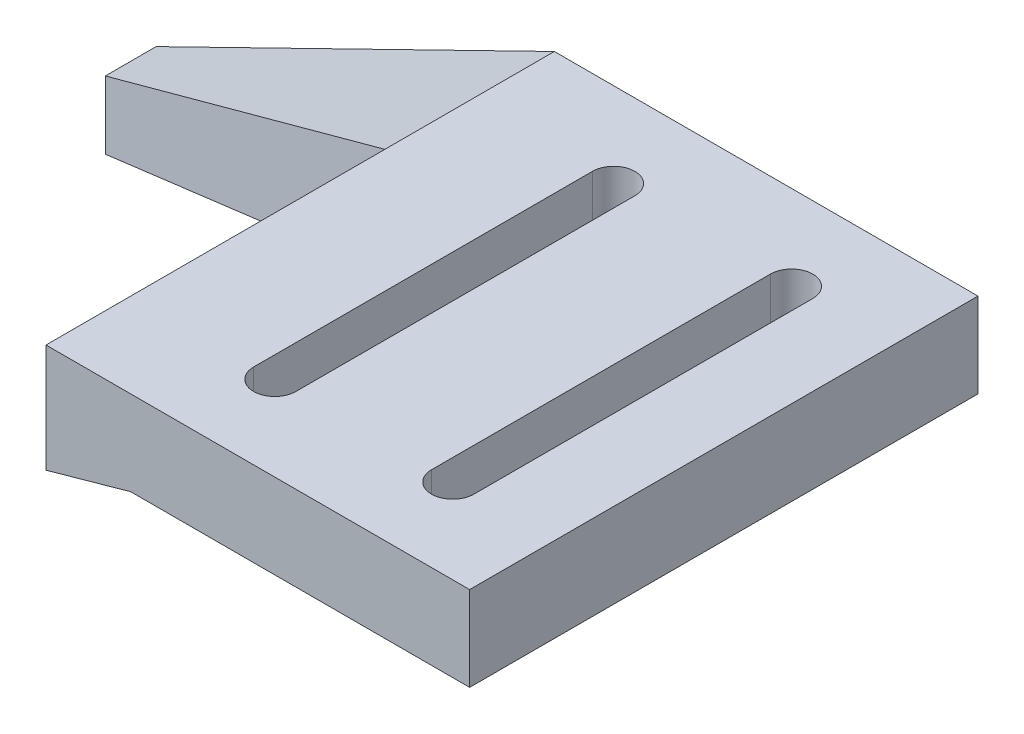
ISO-10303-21;
HEADER;
FILE_DESCRIPTION(('STEP AP214'),'2;1');
FILE_NAME('part.step','',(''),(''),'','','');
FILE_SCHEMA(('AUTOMOTIVE_DESIGN { 1 0 10303 214 1 1 1 1 }'));
ENDSEC;
DATA;
#1=APPLICATION_CONTEXT('core data for automotive mechanical design processes');
#2=APPLICATION_PROTOCOL_DEFINITION('international standard','automotive_design',2000,#1);
#3=PRODUCT_CONTEXT('',#1,'mechanical');
#4=PRODUCT('Part','Part','',(#3));
#5=PRODUCT_RELATED_PRODUCT_CATEGORY('part','',(#4));
#6=PRODUCT_DEFINITION_FORMATION('','',#4);
#7=PRODUCT_DEFINITION_CONTEXT('part definition',#1,'design');
#8=PRODUCT_DEFINITION('design','',#6,#7);
#9=PRODUCT_DEFINITION_SHAPE('','',#8);
#10=(LENGTH_UNIT() NAMED_UNIT(*) SI_UNIT(.MILLI.,.METRE.));
#11=(NAMED_UNIT(*) PLANE_ANGLE_UNIT() SI_UNIT($,.RADIAN.));
#12=(NAMED_UNIT(*) SI_UNIT($,.STERADIAN.) SOLID_ANGLE_UNIT());
#13=UNCERTAINTY_MEASURE_WITH_UNIT(LENGTH_MEASURE(1.E-05),#10,'distance_accuracy_value','');
#14=(GEOMETRIC_REPRESENTATION_CONTEXT(3) GLOBAL_UNCERTAINTY_ASSIGNED_CONTEXT((#13)) GLOBAL_UNIT_ASSIGNED_CONTEXT((#10,
#11,#12)) REPRESENTATION_CONTEXT('',''));
#15=CARTESIAN_POINT('',(0.,0.,0.));
#16=DIRECTION('',(0.,0.,1.));
#17=DIRECTION('',(1.,0.,0.));
#18=AXIS2_PLACEMENT_3D('',#15,#16,#17);
#19=CARTESIAN_POINT('',(0.44139465875371,-1.57640949554897,5.));
#20=DIRECTION('',(-0.269629925519971,0.962964019714182,0.));
#21=DIRECTION('',(-0.962964019714182,-0.269629925519971,0.));
#22=AXIS2_PLACEMENT_3D('',#19,#20,#21);
#23=PLANE('',#22);
#24=DIRECTION('',(0.,0.,-1.));
#25=VECTOR('',#24,1.);
#26=CARTESIAN_POINT('',(-22.5,-8.,5.));
#27=LINE('',#26,#25);
#28=CARTESIAN_POINT('',(-22.5,-8.,1.5));
#29=VERTEX_POINT('',#28);
#30=CARTESIAN_POINT('',(-22.5,-8.,-1.5));
#31=VERTEX_POINT('',#30);
#32=EDGE_CURVE('E306',#29,#31,#27,.T.);
#33=ORIENTED_EDGE('',*,*,#32,.T.);
#34=DIRECTION('',(0.9495751305048,0.265881036541344,-0.16617564783834));
#35=VECTOR('',#34,1.);
#36=CARTESIAN_POINT('',(-1.2177926557111,-2.04098194359911,-5.22438628525056));
#37=LINE('',#36,#35);
#38=CARTESIAN_POINT('',(-2.49999999999999,-2.4,-5.));
#39=VERTEX_POINT('',#38);
#40=EDGE_CURVE('E279',#31,#39,#37,.T.);
#41=ORIENTED_EDGE('',*,*,#40,.T.);
#42=DIRECTION('',(0.962964019714182,0.269629925519971,0.));
#43=VECTOR('',#42,1.);
#44=CARTESIAN_POINT('',(0.44139465875371,-1.57640949554897,-5.));
#45=LINE('',#44,#43);
#46=CARTESIAN_POINT('',(2.50000000000001,-1.,-5.));
#47=VERTEX_POINT('',#46);
#48=EDGE_CURVE('E291',#39,#47,#45,.T.);
#49=ORIENTED_EDGE('',*,*,#48,.T.);
#50=DIRECTION('',(0.,0.,-1.));
#51=VECTOR('',#50,1.);
#52=CARTESIAN_POINT('',(2.50000000000001,-1.,5.));
#53=LINE('',#52,#51);
#54=CARTESIAN_POINT('',(2.50000000000001,-1.,25.));
#55=VERTEX_POINT('',#54);
#56=EDGE_CURVE('E324',#55,#47,#53,.T.);
#57=ORIENTED_EDGE('',*,*,#56,.F.);
#58=DIRECTION('',(0.962964019714182,0.269629925519971,0.));
#59=VECTOR('',#58,1.);
#60=CARTESIAN_POINT('',(-2.49999999999998,-2.4,25.));
#61=LINE('',#60,#59);
#62=CARTESIAN_POINT('',(-2.49999999999998,-2.4,25.));
#63=VERTEX_POINT('',#62);
#64=EDGE_CURVE('E248',#63,#55,#61,.T.);
#65=ORIENTED_EDGE('',*,*,#64,.F.);
#66=DIRECTION('',(0.,0.,-1.));
#67=VECTOR('',#66,1.);
#68=CARTESIAN_POINT('',(-2.49999999999998,-2.4,25.));
#69=LINE('',#68,#67);
#70=CARTESIAN_POINT('',(-2.49999999999998,-2.4,5.));
#71=VERTEX_POINT('',#70);
#72=EDGE_CURVE('E260',#63,#71,#69,.T.);
#73=ORIENTED_EDGE('',*,*,#72,.T.);
#74=DIRECTION('',(-0.9495751305048,-0.265881036541344,-0.16617564783834));
#75=VECTOR('',#74,1.);
#76=CARTESIAN_POINT('',(0.360169969117019,-1.59915240864724,5.50052974459547));
#77=LINE('',#76,#75);
#78=EDGE_CURVE('E287',#71,#29,#77,.T.);
#79=ORIENTED_EDGE('',*,*,#78,.T.);
#80=EDGE_LOOP('',(#33,#41,#49,#57,#65,#73,#79));
#81=FACE_BOUND('',#80,.T.);
#82=ADVANCED_FACE('F41',(#81),#23,.F.);
#83=CARTESIAN_POINT('',(0.,-1.,5.));
#84=DIRECTION('',(0.,-1.,0.));
#85=DIRECTION('',(1.,0.,0.));
#86=AXIS2_PLACEMENT_3D('',#83,#84,#85);
#87=PLANE('',#86);
#88=CARTESIAN_POINT('',(6.,-1.,0.));
#89=DIRECTION('',(0.,-1.,0.));
#90=DIRECTION('',(1.,0.,0.));
#91=AXIS2_PLACEMENT_3D('',#88,#89,#90);
#92=CIRCLE('',#91,1.25);
#93=CARTESIAN_POINT('',(4.75,-1.,0.));
#94=VERTEX_POINT('',#93);
#95=CARTESIAN_POINT('',(7.25,-1.,0.));
#96=VERTEX_POINT('',#95);
#97=EDGE_CURVE('E238',#94,#96,#92,.T.);
#98=ORIENTED_EDGE('',*,*,#97,.F.);
#99=DIRECTION('',(0.,0.,-1.));
#100=VECTOR('',#99,1.);
#101=CARTESIAN_POINT('',(4.75,-1.,5.));
#102=LINE('',#101,#100);
#103=CARTESIAN_POINT('',(4.75,-1.,20.));
#104=VERTEX_POINT('',#103);
#105=EDGE_CURVE('E230',#104,#94,#102,.T.);
#106=ORIENTED_EDGE('',*,*,#105,.F.);
#107=CARTESIAN_POINT('',(6.,-1.,20.));
#108=DIRECTION('',(0.,-1.,0.));
#109=DIRECTION('',(1.,0.,0.));
#110=AXIS2_PLACEMENT_3D('',#107,#108,#109);
#111=CIRCLE('',#110,1.25);
#112=CARTESIAN_POINT('',(7.25,-1.,20.));
#113=VERTEX_POINT('',#112);
#114=EDGE_CURVE('E159',#113,#104,#111,.T.);
#115=ORIENTED_EDGE('',*,*,#114,.F.);
#116=DIRECTION('',(0.,0.,1.));
#117=VECTOR('',#116,1.);
#118=CARTESIAN_POINT('',(7.25,-1.,5.));
#119=LINE('',#118,#117);
#120=EDGE_CURVE('E235',#96,#113,#119,.T.);
#121=ORIENTED_EDGE('',*,*,#120,.F.);
#122=EDGE_LOOP('',(#98,#106,#115,#121));
#123=FACE_BOUND('',#122,.T.);
#124=CARTESIAN_POINT('',(16.5,-0.999999999999997,0.));
#125=DIRECTION('',(0.,-1.,0.));
#126=DIRECTION('',(1.,0.,0.));
#127=AXIS2_PLACEMENT_3D('',#124,#125,#126);
#128=CIRCLE('',#127,1.25);
#129=CARTESIAN_POINT('',(15.25,-1.,0.));
#130=VERTEX_POINT('',#129);
#131=CARTESIAN_POINT('',(17.75,-0.999999999999997,0.));
#132=VERTEX_POINT('',#131);
#133=EDGE_CURVE('E227',#130,#132,#128,.T.);
#134=ORIENTED_EDGE('',*,*,#133,.F.);
#135=DIRECTION('',(0.,0.,-1.));
#136=VECTOR('',#135,1.);
#137=CARTESIAN_POINT('',(15.25,-0.999999999999999,5.));
#138=LINE('',#137,#136);
#139=CARTESIAN_POINT('',(15.25,-0.999999999999999,20.));
#140=VERTEX_POINT('',#139);
#141=EDGE_CURVE('E188',#140,#130,#138,.T.);
#142=ORIENTED_EDGE('',*,*,#141,.F.);
#143=CARTESIAN_POINT('',(16.5,-0.999999999999997,20.));
#144=DIRECTION('',(0.,-1.,0.));
#145=DIRECTION('',(1.,0.,0.));
#146=AXIS2_PLACEMENT_3D('',#143,#144,#145);
#147=CIRCLE('',#146,1.25);
#148=CARTESIAN_POINT('',(17.75,-0.999999999999997,20.));
#149=VERTEX_POINT('',#148);
#150=EDGE_CURVE('E221',#149,#140,#147,.T.);
#151=ORIENTED_EDGE('',*,*,#150,.F.);
#152=DIRECTION('',(0.,0.,1.));
#153=VECTOR('',#152,1.);
#154=CARTESIAN_POINT('',(17.75,-0.999999999999999,5.));
#155=LINE('',#154,#153);
#156=EDGE_CURVE('E224',#132,#149,#155,.T.);
#157=ORIENTED_EDGE('',*,*,#156,.F.);
#158=EDGE_LOOP('',(#134,#142,#151,#157));
#159=FACE_BOUND('',#158,.T.);
#160=DIRECTION('',(-1.,0.,0.));
#161=VECTOR('',#160,1.);
#162=CARTESIAN_POINT('',(0.,-1.,-5.));
#163=LINE('',#162,#161);
#164=CARTESIAN_POINT('',(22.5,-0.999999999999998,-5.));
#165=VERTEX_POINT('',#164);
#166=EDGE_CURVE('E294',#165,#47,#163,.T.);
#167=ORIENTED_EDGE('',*,*,#166,.F.);
#168=DIRECTION('',(0.,0.,-1.));
#169=VECTOR('',#168,1.);
#170=CARTESIAN_POINT('',(22.5,-0.999999999999998,5.));
#171=LINE('',#170,#169);
#172=CARTESIAN_POINT('',(22.5,-0.999999999999998,25.));
#173=VERTEX_POINT('',#172);
#174=EDGE_CURVE('E321',#173,#165,#171,.T.);
#175=ORIENTED_EDGE('',*,*,#174,.F.);
#176=DIRECTION('',(1.,0.,0.));
#177=VECTOR('',#176,1.);
#178=CARTESIAN_POINT('',(2.50000000000001,-1.,25.));
#179=LINE('',#178,#177);
#180=EDGE_CURVE('E252',#55,#173,#179,.T.);
#181=ORIENTED_EDGE('',*,*,#180,.F.);
#182=ORIENTED_EDGE('',*,*,#56,.T.);
#183=EDGE_LOOP('',(#167,#175,#181,#182));
#184=FACE_BOUND('',#183,.T.);
#185=ADVANCED_FACE('F355',(#123,#159,#184),#87,.T.);
#186=CARTESIAN_POINT('',(22.5,0.,5.));
#187=DIRECTION('',(1.,0.,0.));
#188=DIRECTION('',(0.,1.,0.));
#189=AXIS2_PLACEMENT_3D('',#186,#187,#188);
#190=PLANE('',#189);
#191=DIRECTION('',(0.,-1.,0.));
#192=VECTOR('',#191,1.);
#193=CARTESIAN_POINT('',(22.5,0.,-5.));
#194=LINE('',#193,#192);
#195=CARTESIAN_POINT('',(22.5,4.,-5.));
#196=VERTEX_POINT('',#195);
#197=EDGE_CURVE('E298',#196,#165,#194,.T.);
#198=ORIENTED_EDGE('',*,*,#197,.F.);
#199=DIRECTION('',(0.,0.,-1.));
#200=VECTOR('',#199,1.);
#201=CARTESIAN_POINT('',(22.5,4.,5.));
#202=LINE('',#201,#200);
#203=CARTESIAN_POINT('',(22.5,4.,25.));
#204=VERTEX_POINT('',#203);
#205=EDGE_CURVE('E318',#204,#196,#202,.T.);
#206=ORIENTED_EDGE('',*,*,#205,.F.);
#207=DIRECTION('',(0.,1.,0.));
#208=VECTOR('',#207,1.);
#209=CARTESIAN_POINT('',(22.5,-0.999999999999998,25.));
#210=LINE('',#209,#208);
#211=EDGE_CURVE('E256',#173,#204,#210,.T.);
#212=ORIENTED_EDGE('',*,*,#211,.F.);
#213=ORIENTED_EDGE('',*,*,#174,.T.);
#214=EDGE_LOOP('',(#198,#206,#212,#213));
#215=FACE_BOUND('',#214,.T.);
#216=ADVANCED_FACE('F352',(#215),#190,.T.);
#217=CARTESIAN_POINT('',(0.,4.,5.));
#218=DIRECTION('',(0.,-1.,0.));
#219=DIRECTION('',(1.,0.,0.));
#220=AXIS2_PLACEMENT_3D('',#217,#218,#219);
#221=PLANE('',#220);
#222=DIRECTION('',(0.,0.,1.));
#223=VECTOR('',#222,1.);
#224=CARTESIAN_POINT('',(4.75,4.,0.));
#225=LINE('',#224,#223);
#226=CARTESIAN_POINT('',(4.75,4.,0.));
#227=VERTEX_POINT('',#226);
#228=CARTESIAN_POINT('',(4.75,4.,20.));
#229=VERTEX_POINT('',#228);
#230=EDGE_CURVE('E167',#227,#229,#225,.T.);
#231=ORIENTED_EDGE('',*,*,#230,.F.);
#232=CARTESIAN_POINT('',(6.,4.,0.));
#233=DIRECTION('',(0.,1.,0.));
#234=DIRECTION('',(-1.,0.,0.));
#235=AXIS2_PLACEMENT_3D('',#232,#233,#234);
#236=CIRCLE('',#235,1.25);
#237=CARTESIAN_POINT('',(7.25,4.,0.));
#238=VERTEX_POINT('',#237);
#239=EDGE_CURVE('E173',#238,#227,#236,.T.);
#240=ORIENTED_EDGE('',*,*,#239,.F.);
#241=DIRECTION('',(0.,0.,-1.));
#242=VECTOR('',#241,1.);
#243=CARTESIAN_POINT('',(7.25,4.,0.));
#244=LINE('',#243,#242);
#245=CARTESIAN_POINT('',(7.25,4.,20.));
#246=VERTEX_POINT('',#245);
#247=EDGE_CURVE('E178',#246,#238,#244,.T.);
#248=ORIENTED_EDGE('',*,*,#247,.F.);
#249=CARTESIAN_POINT('',(6.,4.,20.));
#250=DIRECTION('',(0.,1.,0.));
#251=DIRECTION('',(-1.,0.,0.));
#252=AXIS2_PLACEMENT_3D('',#249,#250,#251);
#253=CIRCLE('',#252,1.25);
#254=EDGE_CURVE('E156',#229,#246,#253,.T.);
#255=ORIENTED_EDGE('',*,*,#254,.F.);
#256=EDGE_LOOP('',(#231,#240,#248,#255));
#257=FACE_BOUND('',#256,.T.);
#258=DIRECTION('',(0.,0.,1.));
#259=VECTOR('',#258,1.);
#260=CARTESIAN_POINT('',(15.25,4.,0.));
#261=LINE('',#260,#259);
#262=CARTESIAN_POINT('',(15.25,4.,0.));
#263=VERTEX_POINT('',#262);
#264=CARTESIAN_POINT('',(15.25,4.,20.));
#265=VERTEX_POINT('',#264);
#266=EDGE_CURVE('E196',#263,#265,#261,.T.);
#267=ORIENTED_EDGE('',*,*,#266,.F.);
#268=CARTESIAN_POINT('',(16.5,4.,0.));
#269=DIRECTION('',(0.,1.,0.));
#270=DIRECTION('',(1.,0.,0.));
#271=AXIS2_PLACEMENT_3D('',#268,#269,#270);
#272=CIRCLE('',#271,1.25);
#273=CARTESIAN_POINT('',(17.75,4.,0.));
#274=VERTEX_POINT('',#273);
#275=EDGE_CURVE('E193',#274,#263,#272,.T.);
#276=ORIENTED_EDGE('',*,*,#275,.F.);
#277=DIRECTION('',(0.,0.,-1.));
#278=VECTOR('',#277,1.);
#279=CARTESIAN_POINT('',(17.75,4.,0.));
#280=LINE('',#279,#278);
#281=CARTESIAN_POINT('',(17.75,4.,20.));
#282=VERTEX_POINT('',#281);
#283=EDGE_CURVE('E203',#282,#274,#280,.T.);
#284=ORIENTED_EDGE('',*,*,#283,.F.);
#285=CARTESIAN_POINT('',(16.5,4.,20.));
#286=DIRECTION('',(0.,1.,0.));
#287=DIRECTION('',(1.,0.,0.));
#288=AXIS2_PLACEMENT_3D('',#285,#286,#287);
#289=CIRCLE('',#288,1.25);
#290=EDGE_CURVE('E199',#265,#282,#289,.T.);
#291=ORIENTED_EDGE('',*,*,#290,.F.);
#292=EDGE_LOOP('',(#267,#276,#284,#291));
#293=FACE_BOUND('',#292,.T.);
#294=DIRECTION('',(-1.,0.,0.));
#295=VECTOR('',#294,1.);
#296=CARTESIAN_POINT('',(0.,4.,-5.));
#297=LINE('',#296,#295);
#298=CARTESIAN_POINT('',(-2.49999999999999,4.,-5.));
#299=VERTEX_POINT('',#298);
#300=EDGE_CURVE('E302',#196,#299,#297,.T.);
#301=ORIENTED_EDGE('',*,*,#300,.T.);
#302=DIRECTION('',(0.,0.,-1.));
#303=VECTOR('',#302,1.);
#304=CARTESIAN_POINT('',(-2.49999999999999,4.,5.));
#305=LINE('',#304,#303);
#306=CARTESIAN_POINT('',(-2.49999999999998,4.,5.));
#307=VERTEX_POINT('',#306);
#308=EDGE_CURVE('E314',#307,#299,#305,.T.);
#309=ORIENTED_EDGE('',*,*,#308,.F.);
#310=DIRECTION('',(0.,0.,-1.));
#311=VECTOR('',#310,1.);
#312=CARTESIAN_POINT('',(-2.49999999999998,4.,25.));
#313=LINE('',#312,#311);
#314=CARTESIAN_POINT('',(-2.49999999999998,4.,25.));
#315=VERTEX_POINT('',#314);
#316=EDGE_CURVE('E264',#315,#307,#313,.T.);
#317=ORIENTED_EDGE('',*,*,#316,.F.);
#318=DIRECTION('',(-1.,0.,0.));
#319=VECTOR('',#318,1.);
#320=CARTESIAN_POINT('',(22.5,4.,25.));
#321=LINE('',#320,#319);
#322=EDGE_CURVE('E241',#204,#315,#321,.T.);
#323=ORIENTED_EDGE('',*,*,#322,.F.);
#324=ORIENTED_EDGE('',*,*,#205,.T.);
#325=EDGE_LOOP('',(#301,#309,#317,#323,#324));
#326=FACE_BOUND('',#325,.T.);
#327=ADVANCED_FACE('F175',(#257,#293,#326),#221,.F.);
#328=CARTESIAN_POINT('',(-1.72413793103448,4.3103448275862,5.));
#329=DIRECTION('',(0.371390676354104,-0.928476690885259,0.));
#330=DIRECTION('',(0.928476690885259,0.371390676354104,0.));
#331=AXIS2_PLACEMENT_3D('',#328,#329,#330);
#332=PLANE('',#331);
#333=ORIENTED_EDGE('',*,*,#308,.T.);
#334=DIRECTION('',(-0.916457862164628,-0.366583144865851,0.16038012587881));
#335=VECTOR('',#334,1.);
#336=CARTESIAN_POINT('',(-3.21391076115485,3.71443569553805,-4.8750656167979));
#337=LINE('',#336,#335);
#338=CARTESIAN_POINT('',(-22.5,-4.,-1.5));
#339=VERTEX_POINT('',#338);
#340=EDGE_CURVE('E272',#299,#339,#337,.T.);
#341=ORIENTED_EDGE('',*,*,#340,.T.);
#342=DIRECTION('',(0.,0.,-1.));
#343=VECTOR('',#342,1.);
#344=CARTESIAN_POINT('',(-22.5,-4.,5.));
#345=LINE('',#344,#343);
#346=CARTESIAN_POINT('',(-22.5,-4.,1.5));
#347=VERTEX_POINT('',#346);
#348=EDGE_CURVE('E310',#347,#339,#345,.T.);
#349=ORIENTED_EDGE('',*,*,#348,.F.);
#350=DIRECTION('',(0.916457862164628,0.366583144865851,0.16038012587881));
#351=VECTOR('',#350,1.);
#352=CARTESIAN_POINT('',(-1.74409448818897,4.30236220472441,5.13228346456693));
#353=LINE('',#352,#351);
#354=EDGE_CURVE('E283',#347,#307,#353,.T.);
#355=ORIENTED_EDGE('',*,*,#354,.T.);
#356=EDGE_LOOP('',(#333,#341,#349,#355));
#357=FACE_BOUND('',#356,.T.);
#358=ADVANCED_FACE('F339',(#357),#332,.F.);
#359=CARTESIAN_POINT('',(-22.5,0.,5.));
#360=DIRECTION('',(1.,0.,0.));
#361=DIRECTION('',(0.,0.,-1.));
#362=AXIS2_PLACEMENT_3D('',#359,#360,#361);
#363=PLANE('',#362);
#364=ORIENTED_EDGE('',*,*,#348,.T.);
#365=DIRECTION('',(0.,1.,0.));
#366=VECTOR('',#365,1.);
#367=CARTESIAN_POINT('',(-22.5,-15.,-1.5));
#368=LINE('',#367,#366);
#369=EDGE_CURVE('E269',#31,#339,#368,.T.);
#370=ORIENTED_EDGE('',*,*,#369,.F.);
#371=ORIENTED_EDGE('',*,*,#32,.F.);
#372=DIRECTION('',(0.,1.,0.));
#373=VECTOR('',#372,1.);
#374=CARTESIAN_POINT('',(-22.5,-15.,1.5));
#375=LINE('',#374,#373);
#376=EDGE_CURVE('E268',#29,#347,#375,.T.);
#377=ORIENTED_EDGE('',*,*,#376,.T.);
#378=EDGE_LOOP('',(#364,#370,#371,#377));
#379=FACE_BOUND('',#378,.T.);
#380=ADVANCED_FACE('F362',(#379),#363,.F.);
#381=CARTESIAN_POINT('',(0.,0.,-5.));
#382=DIRECTION('',(0.,0.,1.));
#383=DIRECTION('',(1.,0.,0.));
#384=AXIS2_PLACEMENT_3D('',#381,#382,#383);
#385=PLANE('',#384);
#386=ORIENTED_EDGE('',*,*,#48,.F.);
#387=DIRECTION('',(0.,1.,0.));
#388=VECTOR('',#387,1.);
#389=CARTESIAN_POINT('',(-2.49999999999999,0.,-5.));
#390=LINE('',#389,#388);
#391=EDGE_CURVE('E49',#39,#299,#390,.T.);
#392=ORIENTED_EDGE('',*,*,#391,.T.);
#393=ORIENTED_EDGE('',*,*,#300,.F.);
#394=ORIENTED_EDGE('',*,*,#197,.T.);
#395=ORIENTED_EDGE('',*,*,#166,.T.);
#396=EDGE_LOOP('',(#386,#392,#393,#394,#395));
#397=FACE_BOUND('',#396,.T.);
#398=ADVANCED_FACE('F332',(#397),#385,.F.);
#399=CARTESIAN_POINT('',(-22.5,-15.,-1.5));
#400=DIRECTION('',(0.172380331752248,0.,0.985030467155704));
#401=DIRECTION('',(0.985030467155704,0.,-0.172380331752248));
#402=AXIS2_PLACEMENT_3D('',#399,#400,#401);
#403=PLANE('',#402);
#404=ORIENTED_EDGE('',*,*,#369,.T.);
#405=ORIENTED_EDGE('',*,*,#340,.F.);
#406=ORIENTED_EDGE('',*,*,#391,.F.);
#407=ORIENTED_EDGE('',*,*,#40,.F.);
#408=EDGE_LOOP('',(#404,#405,#406,#407));
#409=FACE_BOUND('',#408,.T.);
#410=ADVANCED_FACE('F360',(#409),#403,.F.);
#411=CARTESIAN_POINT('',(-22.5,-15.,1.5));
#412=DIRECTION('',(0.172380331752248,0.,-0.985030467155704));
#413=DIRECTION('',(-0.985030467155704,0.,-0.172380331752248));
#414=AXIS2_PLACEMENT_3D('',#411,#412,#413);
#415=PLANE('',#414);
#416=DIRECTION('',(0.,1.,0.));
#417=VECTOR('',#416,1.);
#418=CARTESIAN_POINT('',(-2.49999999999998,0.,5.));
#419=LINE('',#418,#417);
#420=EDGE_CURVE('E11',#71,#307,#419,.T.);
#421=ORIENTED_EDGE('',*,*,#420,.T.);
#422=ORIENTED_EDGE('',*,*,#354,.F.);
#423=ORIENTED_EDGE('',*,*,#376,.F.);
#424=ORIENTED_EDGE('',*,*,#78,.F.);
#425=EDGE_LOOP('',(#421,#422,#423,#424));
#426=FACE_BOUND('',#425,.T.);
#427=ADVANCED_FACE('F343',(#426),#415,.F.);
#428=CARTESIAN_POINT('',(-2.49999999999998,4.,25.));
#429=DIRECTION('',(1.,0.,0.));
#430=DIRECTION('',(0.,1.,0.));
#431=AXIS2_PLACEMENT_3D('',#428,#429,#430);
#432=PLANE('',#431);
#433=ORIENTED_EDGE('',*,*,#420,.F.);
#434=ORIENTED_EDGE('',*,*,#72,.F.);
#435=DIRECTION('',(0.,-1.,0.));
#436=VECTOR('',#435,1.);
#437=CARTESIAN_POINT('',(-2.49999999999998,4.,25.));
#438=LINE('',#437,#436);
#439=EDGE_CURVE('E245',#315,#63,#438,.T.);
#440=ORIENTED_EDGE('',*,*,#439,.F.);
#441=ORIENTED_EDGE('',*,*,#316,.T.);
#442=EDGE_LOOP('',(#433,#434,#440,#441));
#443=FACE_BOUND('',#442,.T.);
#444=ADVANCED_FACE('F346',(#443),#432,.F.);
#445=CARTESIAN_POINT('',(0.,0.,25.));
#446=DIRECTION('',(0.,0.,1.));
#447=DIRECTION('',(1.,0.,0.));
#448=AXIS2_PLACEMENT_3D('',#445,#446,#447);
#449=PLANE('',#448);
#450=ORIENTED_EDGE('',*,*,#322,.T.);
#451=ORIENTED_EDGE('',*,*,#439,.T.);
#452=ORIENTED_EDGE('',*,*,#64,.T.);
#453=ORIENTED_EDGE('',*,*,#180,.T.);
#454=ORIENTED_EDGE('',*,*,#211,.T.);
#455=EDGE_LOOP('',(#450,#451,#452,#453,#454));
#456=FACE_BOUND('',#455,.T.);
#457=ADVANCED_FACE('F348',(#456),#449,.T.);
#458=CARTESIAN_POINT('',(16.5,-26.,0.));
#459=DIRECTION('',(0.,1.,0.));
#460=DIRECTION('',(-1.,0.,0.));
#461=AXIS2_PLACEMENT_3D('',#458,#459,#460);
#462=CYLINDRICAL_SURFACE('',#461,1.25);
#463=ORIENTED_EDGE('',*,*,#133,.T.);
#464=DIRECTION('',(0.,1.,0.));
#465=VECTOR('',#464,1.);
#466=CARTESIAN_POINT('',(17.75,-26.,0.));
#467=LINE('',#466,#465);
#468=EDGE_CURVE('E208',#132,#274,#467,.T.);
#469=ORIENTED_EDGE('',*,*,#468,.T.);
#470=ORIENTED_EDGE('',*,*,#275,.T.);
#471=DIRECTION('',(0.,1.,0.));
#472=VECTOR('',#471,1.);
#473=CARTESIAN_POINT('',(15.25,-26.,0.));
#474=LINE('',#473,#472);
#475=EDGE_CURVE('E207',#130,#263,#474,.T.);
#476=ORIENTED_EDGE('',*,*,#475,.F.);
#477=EDGE_LOOP('',(#463,#469,#470,#476));
#478=FACE_BOUND('',#477,.T.);
#479=ADVANCED_FACE('F448',(#478),#462,.F.);
#480=CARTESIAN_POINT('',(17.75,-26.,0.));
#481=DIRECTION('',(1.,0.,0.));
#482=DIRECTION('',(0.,1.,0.));
#483=AXIS2_PLACEMENT_3D('',#480,#481,#482);
#484=PLANE('',#483);
#485=ORIENTED_EDGE('',*,*,#156,.T.);
#486=DIRECTION('',(0.,1.,0.));
#487=VECTOR('',#486,1.);
#488=CARTESIAN_POINT('',(17.75,-26.,20.));
#489=LINE('',#488,#487);
#490=EDGE_CURVE('E211',#149,#282,#489,.T.);
#491=ORIENTED_EDGE('',*,*,#490,.T.);
#492=ORIENTED_EDGE('',*,*,#283,.T.);
#493=ORIENTED_EDGE('',*,*,#468,.F.);
#494=EDGE_LOOP('',(#485,#491,#492,#493));
#495=FACE_BOUND('',#494,.T.);
#496=ADVANCED_FACE('F471',(#495),#484,.F.);
#497=CARTESIAN_POINT('',(16.5,-26.,20.));
#498=DIRECTION('',(0.,1.,0.));
#499=DIRECTION('',(-1.,0.,0.));
#500=AXIS2_PLACEMENT_3D('',#497,#498,#499);
#501=CYLINDRICAL_SURFACE('',#500,1.25);
#502=ORIENTED_EDGE('',*,*,#150,.T.);
#503=DIRECTION('',(0.,1.,0.));
#504=VECTOR('',#503,1.);
#505=CARTESIAN_POINT('',(15.25,-26.,20.));
#506=LINE('',#505,#504);
#507=EDGE_CURVE('E64',#140,#265,#506,.T.);
#508=ORIENTED_EDGE('',*,*,#507,.T.);
#509=ORIENTED_EDGE('',*,*,#290,.T.);
#510=ORIENTED_EDGE('',*,*,#490,.F.);
#511=EDGE_LOOP('',(#502,#508,#509,#510));
#512=FACE_BOUND('',#511,.T.);
#513=ADVANCED_FACE('F478',(#512),#501,.F.);
#514=CARTESIAN_POINT('',(15.25,-26.,0.));
#515=DIRECTION('',(-1.,0.,0.));
#516=DIRECTION('',(0.,0.,1.));
#517=AXIS2_PLACEMENT_3D('',#514,#515,#516);
#518=PLANE('',#517);
#519=ORIENTED_EDGE('',*,*,#141,.T.);
#520=ORIENTED_EDGE('',*,*,#475,.T.);
#521=ORIENTED_EDGE('',*,*,#266,.T.);
#522=ORIENTED_EDGE('',*,*,#507,.F.);
#523=EDGE_LOOP('',(#519,#520,#521,#522));
#524=FACE_BOUND('',#523,.T.);
#525=ADVANCED_FACE('F486',(#524),#518,.F.);
#526=CARTESIAN_POINT('',(6.,-26.,0.));
#527=DIRECTION('',(0.,1.,0.));
#528=DIRECTION('',(-1.,0.,0.));
#529=AXIS2_PLACEMENT_3D('',#526,#527,#528);
#530=CYLINDRICAL_SURFACE('',#529,1.25);
#531=ORIENTED_EDGE('',*,*,#97,.T.);
#532=DIRECTION('',(0.,1.,0.));
#533=VECTOR('',#532,1.);
#534=CARTESIAN_POINT('',(7.25,-26.,0.));
#535=LINE('',#534,#533);
#536=EDGE_CURVE('E185',#96,#238,#535,.T.);
#537=ORIENTED_EDGE('',*,*,#536,.T.);
#538=ORIENTED_EDGE('',*,*,#239,.T.);
#539=DIRECTION('',(0.,1.,0.));
#540=VECTOR('',#539,1.);
#541=CARTESIAN_POINT('',(4.75,-26.,0.));
#542=LINE('',#541,#540);
#543=EDGE_CURVE('E163',#94,#227,#542,.T.);
#544=ORIENTED_EDGE('',*,*,#543,.F.);
#545=EDGE_LOOP('',(#531,#537,#538,#544));
#546=FACE_BOUND('',#545,.T.);
#547=ADVANCED_FACE('F494',(#546),#530,.F.);
#548=CARTESIAN_POINT('',(7.25,-26.,0.));
#549=DIRECTION('',(1.,0.,0.));
#550=DIRECTION('',(0.,0.,-1.));
#551=AXIS2_PLACEMENT_3D('',#548,#549,#550);
#552=PLANE('',#551);
#553=ORIENTED_EDGE('',*,*,#120,.T.);
#554=DIRECTION('',(0.,1.,0.));
#555=VECTOR('',#554,1.);
#556=CARTESIAN_POINT('',(7.25000000000001,-26.,20.));
#557=LINE('',#556,#555);
#558=EDGE_CURVE('E162',#113,#246,#557,.T.);
#559=ORIENTED_EDGE('',*,*,#558,.T.);
#560=ORIENTED_EDGE('',*,*,#247,.T.);
#561=ORIENTED_EDGE('',*,*,#536,.F.);
#562=EDGE_LOOP('',(#553,#559,#560,#561));
#563=FACE_BOUND('',#562,.T.);
#564=ADVANCED_FACE('F501',(#563),#552,.F.);
#565=CARTESIAN_POINT('',(6.00000000000001,-26.,20.));
#566=DIRECTION('',(0.,1.,0.));
#567=DIRECTION('',(-1.,0.,0.));
#568=AXIS2_PLACEMENT_3D('',#565,#566,#567);
#569=CYLINDRICAL_SURFACE('',#568,1.25);
#570=ORIENTED_EDGE('',*,*,#114,.T.);
#571=DIRECTION('',(0.,1.,0.));
#572=VECTOR('',#571,1.);
#573=CARTESIAN_POINT('',(4.75,-26.,20.));
#574=LINE('',#573,#572);
#575=EDGE_CURVE('E56',#104,#229,#574,.T.);
#576=ORIENTED_EDGE('',*,*,#575,.T.);
#577=ORIENTED_EDGE('',*,*,#254,.T.);
#578=ORIENTED_EDGE('',*,*,#558,.F.);
#579=EDGE_LOOP('',(#570,#576,#577,#578));
#580=FACE_BOUND('',#579,.T.);
#581=ADVANCED_FACE('F153',(#580),#569,.F.);
#582=CARTESIAN_POINT('',(4.75,-26.,0.));
#583=DIRECTION('',(-1.,0.,0.));
#584=DIRECTION('',(0.,-1.,0.));
#585=AXIS2_PLACEMENT_3D('',#582,#583,#584);
#586=PLANE('',#585);
#587=ORIENTED_EDGE('',*,*,#105,.T.);
#588=ORIENTED_EDGE('',*,*,#543,.T.);
#589=ORIENTED_EDGE('',*,*,#230,.T.);
#590=ORIENTED_EDGE('',*,*,#575,.F.);
#591=EDGE_LOOP('',(#587,#588,#589,#590));
#592=FACE_BOUND('',#591,.T.);
#593=ADVANCED_FACE('F168',(#592),#586,.F.);
#594=CLOSED_SHELL('',(#82,#185,#216,#327,#358,#380,#398,#410,#427,#444,#457,#479,#496,#513,#525,
#547,#564,#581,#593));
#595=MANIFOLD_SOLID_BREP('B2',#594);
#596=ADVANCED_BREP_SHAPE_REPRESENTATION('',(#18,#595),#14);
#597=SHAPE_DEFINITION_REPRESENTATION(#9,#596);
ENDSEC;
END-ISO-10303-21;
